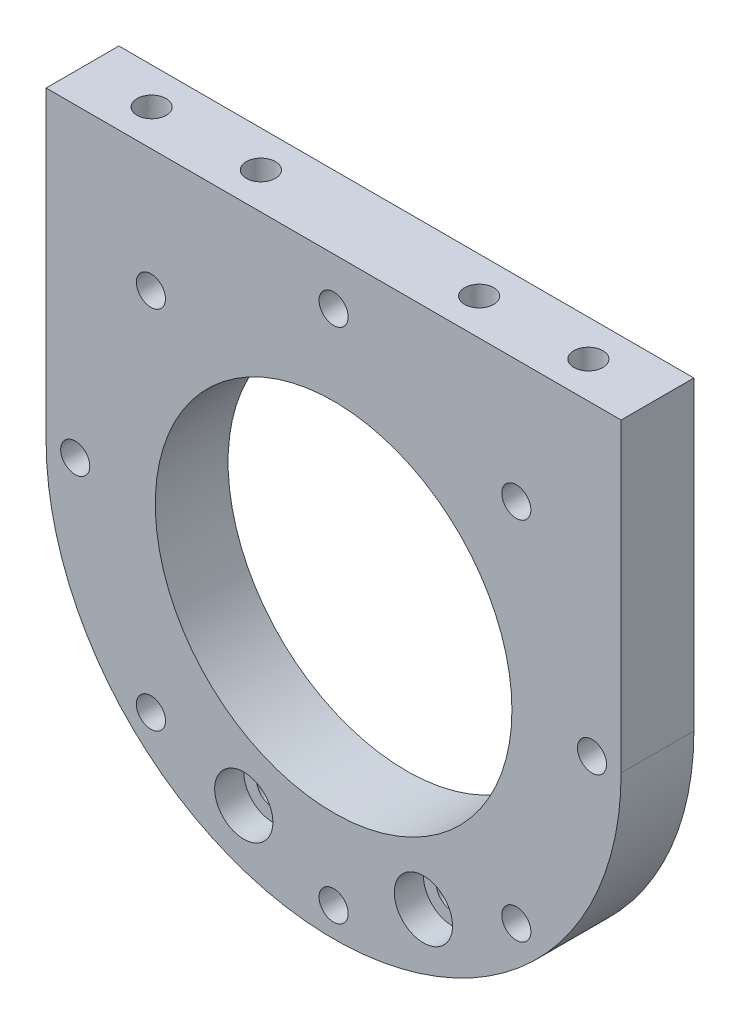
ISO-10303-21;
HEADER;
FILE_DESCRIPTION(('STEP AP214'),'2;1');
FILE_NAME('part.step','',(''),(''),'','','');
FILE_SCHEMA(('AUTOMOTIVE_DESIGN { 1 0 10303 214 1 1 1 1 }'));
ENDSEC;
DATA;
#1=APPLICATION_CONTEXT('core data for automotive mechanical design processes');
#2=APPLICATION_PROTOCOL_DEFINITION('international standard','automotive_design',2000,#1);
#3=PRODUCT_CONTEXT('',#1,'mechanical');
#4=PRODUCT('Part','Part','',(#3));
#5=PRODUCT_RELATED_PRODUCT_CATEGORY('part','',(#4));
#6=PRODUCT_DEFINITION_FORMATION('','',#4);
#7=PRODUCT_DEFINITION_CONTEXT('part definition',#1,'design');
#8=PRODUCT_DEFINITION('design','',#6,#7);
#9=PRODUCT_DEFINITION_SHAPE('','',#8);
#10=(LENGTH_UNIT() NAMED_UNIT(*) SI_UNIT(.MILLI.,.METRE.));
#11=(NAMED_UNIT(*) PLANE_ANGLE_UNIT() SI_UNIT($,.RADIAN.));
#12=(NAMED_UNIT(*) SI_UNIT($,.STERADIAN.) SOLID_ANGLE_UNIT());
#13=UNCERTAINTY_MEASURE_WITH_UNIT(LENGTH_MEASURE(1.E-05),#10,'distance_accuracy_value','');
#14=(GEOMETRIC_REPRESENTATION_CONTEXT(3) GLOBAL_UNCERTAINTY_ASSIGNED_CONTEXT((#13)) GLOBAL_UNIT_ASSIGNED_CONTEXT((#10,
#11,#12)) REPRESENTATION_CONTEXT('',''));
#15=CARTESIAN_POINT('',(0.,0.,0.));
#16=DIRECTION('',(0.,0.,1.));
#17=DIRECTION('',(1.,0.,0.));
#18=AXIS2_PLACEMENT_3D('',#15,#16,#17);
#19=CARTESIAN_POINT('',(12.3415406937742,-29.795114923489,10.));
#20=DIRECTION('',(0.,0.,-1.));
#21=DIRECTION('',(-1.,0.,0.));
#22=AXIS2_PLACEMENT_3D('',#19,#20,#21);
#23=CYLINDRICAL_SURFACE('',#22,2.25);
#24=CARTESIAN_POINT('',(12.3415406937742,-29.795114923489,0.));
#25=DIRECTION('',(0.,0.,1.));
#26=DIRECTION('',(1.,0.,0.));
#27=AXIS2_PLACEMENT_3D('',#24,#25,#26);
#28=CIRCLE('',#27,2.25);
#29=CARTESIAN_POINT('',(14.5915406937742,-29.795114923489,0.));
#30=VERTEX_POINT('',#29);
#31=EDGE_CURVE('E148',#30,#30,#28,.T.);
#32=ORIENTED_EDGE('',*,*,#31,.F.);
#33=EDGE_LOOP('',(#32));
#34=FACE_BOUND('',#33,.T.);
#35=CARTESIAN_POINT('',(12.3415406937742,-29.795114923489,6.));
#36=DIRECTION('',(0.,0.,1.));
#37=DIRECTION('',(1.,0.,0.));
#38=AXIS2_PLACEMENT_3D('',#35,#36,#37);
#39=CIRCLE('',#38,2.25);
#40=CARTESIAN_POINT('',(14.5915406937742,-29.795114923489,6.));
#41=VERTEX_POINT('',#40);
#42=EDGE_CURVE('E38',#41,#41,#39,.T.);
#43=ORIENTED_EDGE('',*,*,#42,.T.);
#44=EDGE_LOOP('',(#43));
#45=FACE_BOUND('',#44,.T.);
#46=ADVANCED_FACE('F34',(#34,#45),#23,.F.);
#47=CARTESIAN_POINT('',(-12.3415406937742,-29.795114923489,10.));
#48=DIRECTION('',(0.,0.,-1.));
#49=DIRECTION('',(-1.,0.,0.));
#50=AXIS2_PLACEMENT_3D('',#47,#48,#49);
#51=CYLINDRICAL_SURFACE('',#50,2.25);
#52=CARTESIAN_POINT('',(-12.3415406937742,-29.795114923489,0.));
#53=DIRECTION('',(0.,0.,1.));
#54=DIRECTION('',(1.,0.,0.));
#55=AXIS2_PLACEMENT_3D('',#52,#53,#54);
#56=CIRCLE('',#55,2.25);
#57=CARTESIAN_POINT('',(-10.0915406937742,-29.795114923489,0.));
#58=VERTEX_POINT('',#57);
#59=EDGE_CURVE('E193',#58,#58,#56,.T.);
#60=ORIENTED_EDGE('',*,*,#59,.F.);
#61=EDGE_LOOP('',(#60));
#62=FACE_BOUND('',#61,.T.);
#63=CARTESIAN_POINT('',(-12.3415406937742,-29.795114923489,6.));
#64=DIRECTION('',(0.,0.,1.));
#65=DIRECTION('',(1.,0.,0.));
#66=AXIS2_PLACEMENT_3D('',#63,#64,#65);
#67=CIRCLE('',#66,2.25);
#68=CARTESIAN_POINT('',(-10.0915406937742,-29.795114923489,6.));
#69=VERTEX_POINT('',#68);
#70=EDGE_CURVE('E110',#69,#69,#67,.T.);
#71=ORIENTED_EDGE('',*,*,#70,.T.);
#72=EDGE_LOOP('',(#71));
#73=FACE_BOUND('',#72,.T.);
#74=ADVANCED_FACE('F229',(#62,#73),#51,.F.);
#75=CARTESIAN_POINT('',(0.,0.,10.));
#76=DIRECTION('',(0.,0.,1.));
#77=DIRECTION('',(1.,0.,0.));
#78=AXIS2_PLACEMENT_3D('',#75,#76,#77);
#79=PLANE('',#78);
#80=CARTESIAN_POINT('',(12.3415406937742,-29.795114923489,10.));
#81=DIRECTION('',(0.,0.,1.));
#82=DIRECTION('',(1.,0.,0.));
#83=AXIS2_PLACEMENT_3D('',#80,#81,#82);
#84=CIRCLE('',#83,4.);
#85=CARTESIAN_POINT('',(16.3415406937742,-29.795114923489,10.));
#86=VERTEX_POINT('',#85);
#87=EDGE_CURVE('E127',#86,#86,#84,.T.);
#88=ORIENTED_EDGE('',*,*,#87,.F.);
#89=EDGE_LOOP('',(#88));
#90=FACE_BOUND('',#89,.T.);
#91=CARTESIAN_POINT('',(-12.3415406937742,-29.795114923489,10.));
#92=DIRECTION('',(0.,0.,1.));
#93=DIRECTION('',(1.,0.,0.));
#94=AXIS2_PLACEMENT_3D('',#91,#92,#93);
#95=CIRCLE('',#94,4.);
#96=CARTESIAN_POINT('',(-8.34154069377417,-29.795114923489,10.));
#97=VERTEX_POINT('',#96);
#98=EDGE_CURVE('E120',#97,#97,#95,.T.);
#99=ORIENTED_EDGE('',*,*,#98,.F.);
#100=EDGE_LOOP('',(#99));
#101=FACE_BOUND('',#100,.T.);
#102=CARTESIAN_POINT('',(25.1022907321221,-25.1022907321227,10.));
#103=DIRECTION('',(0.,0.,1.));
#104=DIRECTION('',(1.,0.,0.));
#105=AXIS2_PLACEMENT_3D('',#102,#103,#104);
#106=CIRCLE('',#105,2.);
#107=CARTESIAN_POINT('',(27.1022907321221,-25.1022907321227,10.));
#108=VERTEX_POINT('',#107);
#109=EDGE_CURVE('E154',#108,#108,#106,.T.);
#110=ORIENTED_EDGE('',*,*,#109,.F.);
#111=EDGE_LOOP('',(#110));
#112=FACE_BOUND('',#111,.T.);
#113=CARTESIAN_POINT('',(25.1022907321227,25.1022907321222,10.));
#114=DIRECTION('',(0.,0.,1.));
#115=DIRECTION('',(1.,0.,0.));
#116=AXIS2_PLACEMENT_3D('',#113,#114,#115);
#117=CIRCLE('',#116,2.);
#118=CARTESIAN_POINT('',(27.1022907321227,25.1022907321222,10.));
#119=VERTEX_POINT('',#118);
#120=EDGE_CURVE('E166',#119,#119,#117,.T.);
#121=ORIENTED_EDGE('',*,*,#120,.F.);
#122=EDGE_LOOP('',(#121));
#123=FACE_BOUND('',#122,.T.);
#124=CARTESIAN_POINT('',(-25.1022907321223,25.1022907321226,10.));
#125=DIRECTION('',(0.,0.,1.));
#126=DIRECTION('',(1.,0.,0.));
#127=AXIS2_PLACEMENT_3D('',#124,#125,#126);
#128=CIRCLE('',#127,2.);
#129=CARTESIAN_POINT('',(-23.1022907321223,25.1022907321226,10.));
#130=VERTEX_POINT('',#129);
#131=EDGE_CURVE('E178',#130,#130,#128,.T.);
#132=ORIENTED_EDGE('',*,*,#131,.F.);
#133=EDGE_LOOP('',(#132));
#134=FACE_BOUND('',#133,.T.);
#135=CARTESIAN_POINT('',(-25.1022907321225,-25.1022907321224,10.));
#136=DIRECTION('',(0.,0.,1.));
#137=DIRECTION('',(1.,0.,0.));
#138=AXIS2_PLACEMENT_3D('',#135,#136,#137);
#139=CIRCLE('',#138,2.);
#140=CARTESIAN_POINT('',(-23.1022907321225,-25.1022907321224,10.));
#141=VERTEX_POINT('',#140);
#142=EDGE_CURVE('E190',#141,#141,#139,.T.);
#143=ORIENTED_EDGE('',*,*,#142,.F.);
#144=EDGE_LOOP('',(#143));
#145=FACE_BOUND('',#144,.T.);
#146=CARTESIAN_POINT('',(0.,0.,10.));
#147=DIRECTION('',(0.,0.,1.));
#148=DIRECTION('',(1.,0.,0.));
#149=AXIS2_PLACEMENT_3D('',#146,#147,#148);
#150=CIRCLE('',#149,24.5);
#151=CARTESIAN_POINT('',(24.5,0.,10.));
#152=VERTEX_POINT('',#151);
#153=EDGE_CURVE('E199',#152,#152,#150,.T.);
#154=ORIENTED_EDGE('',*,*,#153,.F.);
#155=EDGE_LOOP('',(#154));
#156=FACE_BOUND('',#155,.T.);
#157=CARTESIAN_POINT('',(0.,0.,10.));
#158=DIRECTION('',(0.,0.,1.));
#159=DIRECTION('',(1.,0.,0.));
#160=AXIS2_PLACEMENT_3D('',#157,#158,#159);
#161=CIRCLE('',#160,39.5);
#162=CARTESIAN_POINT('',(-39.5,0.,10.));
#163=VERTEX_POINT('',#162);
#164=CARTESIAN_POINT('',(39.5,0.,10.));
#165=VERTEX_POINT('',#164);
#166=EDGE_CURVE('E89',#163,#165,#161,.T.);
#167=ORIENTED_EDGE('',*,*,#166,.T.);
#168=DIRECTION('',(0.,1.,0.));
#169=VECTOR('',#168,1.);
#170=CARTESIAN_POINT('',(39.5,42.,10.));
#171=LINE('',#170,#169);
#172=CARTESIAN_POINT('',(39.5,42.,10.));
#173=VERTEX_POINT('',#172);
#174=EDGE_CURVE('E83',#165,#173,#171,.T.);
#175=ORIENTED_EDGE('',*,*,#174,.T.);
#176=DIRECTION('',(-1.,0.,0.));
#177=VECTOR('',#176,1.);
#178=CARTESIAN_POINT('',(-39.5,42.,10.));
#179=LINE('',#178,#177);
#180=CARTESIAN_POINT('',(-39.5,42.,10.));
#181=VERTEX_POINT('',#180);
#182=EDGE_CURVE('E87',#173,#181,#179,.T.);
#183=ORIENTED_EDGE('',*,*,#182,.T.);
#184=DIRECTION('',(0.,-1.,0.));
#185=VECTOR('',#184,1.);
#186=CARTESIAN_POINT('',(-39.5,0.,10.));
#187=LINE('',#186,#185);
#188=EDGE_CURVE('E53',#181,#163,#187,.T.);
#189=ORIENTED_EDGE('',*,*,#188,.T.);
#190=EDGE_LOOP('',(#167,#175,#183,#189));
#191=FACE_BOUND('',#190,.T.);
#192=CARTESIAN_POINT('',(0.,-35.5,10.));
#193=DIRECTION('',(0.,0.,1.));
#194=DIRECTION('',(1.,0.,0.));
#195=AXIS2_PLACEMENT_3D('',#192,#193,#194);
#196=CIRCLE('',#195,2.);
#197=CARTESIAN_POINT('',(2.,-35.5,10.));
#198=VERTEX_POINT('',#197);
#199=EDGE_CURVE('E105',#198,#198,#196,.T.);
#200=ORIENTED_EDGE('',*,*,#199,.F.);
#201=EDGE_LOOP('',(#200));
#202=FACE_BOUND('',#201,.T.);
#203=CARTESIAN_POINT('',(-35.5,1.23947587528931E-13,10.));
#204=DIRECTION('',(0.,0.,1.));
#205=DIRECTION('',(1.,0.,0.));
#206=AXIS2_PLACEMENT_3D('',#203,#204,#205);
#207=CIRCLE('',#206,2.);
#208=CARTESIAN_POINT('',(-33.5,1.23947587528931E-13,10.));
#209=VERTEX_POINT('',#208);
#210=EDGE_CURVE('E184',#209,#209,#207,.T.);
#211=ORIENTED_EDGE('',*,*,#210,.F.);
#212=EDGE_LOOP('',(#211));
#213=FACE_BOUND('',#212,.T.);
#214=CARTESIAN_POINT('',(2.47895175057862E-13,35.5,10.));
#215=DIRECTION('',(0.,0.,1.));
#216=DIRECTION('',(1.,0.,0.));
#217=AXIS2_PLACEMENT_3D('',#214,#215,#216);
#218=CIRCLE('',#217,2.);
#219=CARTESIAN_POINT('',(2.00000000000025,35.5,10.));
#220=VERTEX_POINT('',#219);
#221=EDGE_CURVE('E172',#220,#220,#218,.T.);
#222=ORIENTED_EDGE('',*,*,#221,.F.);
#223=EDGE_LOOP('',(#222));
#224=FACE_BOUND('',#223,.T.);
#225=CARTESIAN_POINT('',(35.5,-3.71842762586794E-13,10.));
#226=DIRECTION('',(0.,0.,1.));
#227=DIRECTION('',(1.,0.,0.));
#228=AXIS2_PLACEMENT_3D('',#225,#226,#227);
#229=CIRCLE('',#228,2.);
#230=CARTESIAN_POINT('',(37.5,-3.71842762586794E-13,10.));
#231=VERTEX_POINT('',#230);
#232=EDGE_CURVE('E160',#231,#231,#229,.T.);
#233=ORIENTED_EDGE('',*,*,#232,.F.);
#234=EDGE_LOOP('',(#233));
#235=FACE_BOUND('',#234,.T.);
#236=ADVANCED_FACE('F84',(#90,#101,#112,#123,#134,#145,#156,#191,#202,#213,#224,#235),#79,.T.);
#237=CARTESIAN_POINT('',(0.,0.,0.));
#238=DIRECTION('',(0.,0.,1.));
#239=DIRECTION('',(1.,0.,0.));
#240=AXIS2_PLACEMENT_3D('',#237,#238,#239);
#241=PLANE('',#240);
#242=CARTESIAN_POINT('',(0.,0.,0.));
#243=DIRECTION('',(0.,0.,1.));
#244=DIRECTION('',(1.,0.,0.));
#245=AXIS2_PLACEMENT_3D('',#242,#243,#244);
#246=CIRCLE('',#245,39.5);
#247=CARTESIAN_POINT('',(-39.5,0.,0.));
#248=VERTEX_POINT('',#247);
#249=CARTESIAN_POINT('',(39.5,0.,0.));
#250=VERTEX_POINT('',#249);
#251=EDGE_CURVE('E102',#248,#250,#246,.T.);
#252=ORIENTED_EDGE('',*,*,#251,.F.);
#253=DIRECTION('',(0.,-1.,0.));
#254=VECTOR('',#253,1.);
#255=CARTESIAN_POINT('',(-39.5,0.,0.));
#256=LINE('',#255,#254);
#257=CARTESIAN_POINT('',(-39.5,42.,0.));
#258=VERTEX_POINT('',#257);
#259=EDGE_CURVE('E76',#258,#248,#256,.T.);
#260=ORIENTED_EDGE('',*,*,#259,.F.);
#261=DIRECTION('',(-1.,0.,0.));
#262=VECTOR('',#261,1.);
#263=CARTESIAN_POINT('',(-39.5,42.,0.));
#264=LINE('',#263,#262);
#265=CARTESIAN_POINT('',(39.5,42.,0.));
#266=VERTEX_POINT('',#265);
#267=EDGE_CURVE('E70',#266,#258,#264,.T.);
#268=ORIENTED_EDGE('',*,*,#267,.F.);
#269=DIRECTION('',(0.,1.,0.));
#270=VECTOR('',#269,1.);
#271=CARTESIAN_POINT('',(39.5,42.,0.));
#272=LINE('',#271,#270);
#273=EDGE_CURVE('E93',#250,#266,#272,.T.);
#274=ORIENTED_EDGE('',*,*,#273,.F.);
#275=EDGE_LOOP('',(#252,#260,#268,#274));
#276=FACE_BOUND('',#275,.T.);
#277=CARTESIAN_POINT('',(0.,-35.5,0.));
#278=DIRECTION('',(0.,0.,1.));
#279=DIRECTION('',(1.,0.,0.));
#280=AXIS2_PLACEMENT_3D('',#277,#278,#279);
#281=CIRCLE('',#280,2.);
#282=CARTESIAN_POINT('',(2.,-35.5,0.));
#283=VERTEX_POINT('',#282);
#284=EDGE_CURVE('E202',#283,#283,#281,.T.);
#285=ORIENTED_EDGE('',*,*,#284,.T.);
#286=EDGE_LOOP('',(#285));
#287=FACE_BOUND('',#286,.T.);
#288=CARTESIAN_POINT('',(0.,0.,0.));
#289=DIRECTION('',(0.,0.,1.));
#290=DIRECTION('',(1.,0.,0.));
#291=AXIS2_PLACEMENT_3D('',#288,#289,#290);
#292=CIRCLE('',#291,24.5);
#293=CARTESIAN_POINT('',(24.5,0.,0.));
#294=VERTEX_POINT('',#293);
#295=EDGE_CURVE('E198',#294,#294,#292,.T.);
#296=ORIENTED_EDGE('',*,*,#295,.T.);
#297=EDGE_LOOP('',(#296));
#298=FACE_BOUND('',#297,.T.);
#299=ORIENTED_EDGE('',*,*,#59,.T.);
#300=EDGE_LOOP('',(#299));
#301=FACE_BOUND('',#300,.T.);
#302=CARTESIAN_POINT('',(-25.1022907321225,-25.1022907321224,0.));
#303=DIRECTION('',(0.,0.,1.));
#304=DIRECTION('',(1.,0.,0.));
#305=AXIS2_PLACEMENT_3D('',#302,#303,#304);
#306=CIRCLE('',#305,2.);
#307=CARTESIAN_POINT('',(-23.1022907321225,-25.1022907321224,0.));
#308=VERTEX_POINT('',#307);
#309=EDGE_CURVE('E187',#308,#308,#306,.T.);
#310=ORIENTED_EDGE('',*,*,#309,.T.);
#311=EDGE_LOOP('',(#310));
#312=FACE_BOUND('',#311,.T.);
#313=CARTESIAN_POINT('',(-35.5,1.23947587528931E-13,0.));
#314=DIRECTION('',(0.,0.,1.));
#315=DIRECTION('',(1.,0.,0.));
#316=AXIS2_PLACEMENT_3D('',#313,#314,#315);
#317=CIRCLE('',#316,2.);
#318=CARTESIAN_POINT('',(-33.5,1.23947587528931E-13,0.));
#319=VERTEX_POINT('',#318);
#320=EDGE_CURVE('E181',#319,#319,#317,.T.);
#321=ORIENTED_EDGE('',*,*,#320,.T.);
#322=EDGE_LOOP('',(#321));
#323=FACE_BOUND('',#322,.T.);
#324=CARTESIAN_POINT('',(-25.1022907321223,25.1022907321226,0.));
#325=DIRECTION('',(0.,0.,1.));
#326=DIRECTION('',(1.,0.,0.));
#327=AXIS2_PLACEMENT_3D('',#324,#325,#326);
#328=CIRCLE('',#327,2.);
#329=CARTESIAN_POINT('',(-23.1022907321223,25.1022907321226,0.));
#330=VERTEX_POINT('',#329);
#331=EDGE_CURVE('E175',#330,#330,#328,.T.);
#332=ORIENTED_EDGE('',*,*,#331,.T.);
#333=EDGE_LOOP('',(#332));
#334=FACE_BOUND('',#333,.T.);
#335=CARTESIAN_POINT('',(2.47895175057862E-13,35.5,0.));
#336=DIRECTION('',(0.,0.,1.));
#337=DIRECTION('',(1.,0.,0.));
#338=AXIS2_PLACEMENT_3D('',#335,#336,#337);
#339=CIRCLE('',#338,2.);
#340=CARTESIAN_POINT('',(2.00000000000025,35.5,0.));
#341=VERTEX_POINT('',#340);
#342=EDGE_CURVE('E169',#341,#341,#339,.T.);
#343=ORIENTED_EDGE('',*,*,#342,.T.);
#344=EDGE_LOOP('',(#343));
#345=FACE_BOUND('',#344,.T.);
#346=CARTESIAN_POINT('',(25.1022907321227,25.1022907321222,0.));
#347=DIRECTION('',(0.,0.,1.));
#348=DIRECTION('',(1.,0.,0.));
#349=AXIS2_PLACEMENT_3D('',#346,#347,#348);
#350=CIRCLE('',#349,2.);
#351=CARTESIAN_POINT('',(27.1022907321227,25.1022907321222,0.));
#352=VERTEX_POINT('',#351);
#353=EDGE_CURVE('E163',#352,#352,#350,.T.);
#354=ORIENTED_EDGE('',*,*,#353,.T.);
#355=EDGE_LOOP('',(#354));
#356=FACE_BOUND('',#355,.T.);
#357=CARTESIAN_POINT('',(35.5,-3.71842762586794E-13,0.));
#358=DIRECTION('',(0.,0.,1.));
#359=DIRECTION('',(1.,0.,0.));
#360=AXIS2_PLACEMENT_3D('',#357,#358,#359);
#361=CIRCLE('',#360,2.);
#362=CARTESIAN_POINT('',(37.5,-3.71842762586794E-13,0.));
#363=VERTEX_POINT('',#362);
#364=EDGE_CURVE('E157',#363,#363,#361,.T.);
#365=ORIENTED_EDGE('',*,*,#364,.T.);
#366=EDGE_LOOP('',(#365));
#367=FACE_BOUND('',#366,.T.);
#368=CARTESIAN_POINT('',(25.1022907321221,-25.1022907321227,0.));
#369=DIRECTION('',(0.,0.,1.));
#370=DIRECTION('',(1.,0.,0.));
#371=AXIS2_PLACEMENT_3D('',#368,#369,#370);
#372=CIRCLE('',#371,2.);
#373=CARTESIAN_POINT('',(27.1022907321221,-25.1022907321227,0.));
#374=VERTEX_POINT('',#373);
#375=EDGE_CURVE('E153',#374,#374,#372,.T.);
#376=ORIENTED_EDGE('',*,*,#375,.T.);
#377=EDGE_LOOP('',(#376));
#378=FACE_BOUND('',#377,.T.);
#379=ORIENTED_EDGE('',*,*,#31,.T.);
#380=EDGE_LOOP('',(#379));
#381=FACE_BOUND('',#380,.T.);
#382=ADVANCED_FACE('F210',(#276,#287,#298,#301,#312,#323,#334,#345,#356,#367,#378,#381),#241,.F.);
#383=CARTESIAN_POINT('',(0.,0.,10.));
#384=DIRECTION('',(0.,0.,-1.));
#385=DIRECTION('',(-1.,0.,0.));
#386=AXIS2_PLACEMENT_3D('',#383,#384,#385);
#387=CYLINDRICAL_SURFACE('',#386,39.5);
#388=ORIENTED_EDGE('',*,*,#251,.T.);
#389=DIRECTION('',(0.,0.,-1.));
#390=VECTOR('',#389,1.);
#391=CARTESIAN_POINT('',(39.5,0.,10.));
#392=LINE('',#391,#390);
#393=EDGE_CURVE('E11',#165,#250,#392,.T.);
#394=ORIENTED_EDGE('',*,*,#393,.F.);
#395=ORIENTED_EDGE('',*,*,#166,.F.);
#396=DIRECTION('',(0.,0.,-1.));
#397=VECTOR('',#396,1.);
#398=CARTESIAN_POINT('',(-39.5,0.,10.));
#399=LINE('',#398,#397);
#400=EDGE_CURVE('E98',#163,#248,#399,.T.);
#401=ORIENTED_EDGE('',*,*,#400,.T.);
#402=EDGE_LOOP('',(#388,#394,#395,#401));
#403=FACE_BOUND('',#402,.T.);
#404=ADVANCED_FACE('F36',(#403),#387,.T.);
#405=CARTESIAN_POINT('',(39.5,42.,10.));
#406=DIRECTION('',(-1.,0.,0.));
#407=DIRECTION('',(0.,0.,1.));
#408=AXIS2_PLACEMENT_3D('',#405,#406,#407);
#409=PLANE('',#408);
#410=ORIENTED_EDGE('',*,*,#273,.T.);
#411=DIRECTION('',(0.,0.,-1.));
#412=VECTOR('',#411,1.);
#413=CARTESIAN_POINT('',(39.5,42.,10.));
#414=LINE('',#413,#412);
#415=EDGE_CURVE('E44',#173,#266,#414,.T.);
#416=ORIENTED_EDGE('',*,*,#415,.F.);
#417=ORIENTED_EDGE('',*,*,#174,.F.);
#418=ORIENTED_EDGE('',*,*,#393,.T.);
#419=EDGE_LOOP('',(#410,#416,#417,#418));
#420=FACE_BOUND('',#419,.T.);
#421=ADVANCED_FACE('F92',(#420),#409,.F.);
#422=CARTESIAN_POINT('',(-39.5,42.,10.));
#423=DIRECTION('',(0.,-1.,0.));
#424=DIRECTION('',(0.,0.,-1.));
#425=AXIS2_PLACEMENT_3D('',#422,#423,#424);
#426=PLANE('',#425);
#427=CARTESIAN_POINT('',(30.,42.,5.));
#428=DIRECTION('',(0.,1.,0.));
#429=DIRECTION('',(0.,0.,1.));
#430=AXIS2_PLACEMENT_3D('',#427,#428,#429);
#431=CIRCLE('',#430,2.);
#432=CARTESIAN_POINT('',(30.,42.,7.));
#433=VERTEX_POINT('',#432);
#434=EDGE_CURVE('E112',#433,#433,#431,.T.);
#435=ORIENTED_EDGE('',*,*,#434,.F.);
#436=EDGE_LOOP('',(#435));
#437=FACE_BOUND('',#436,.T.);
#438=CARTESIAN_POINT('',(15.,42.,5.));
#439=DIRECTION('',(0.,1.,0.));
#440=DIRECTION('',(0.,0.,1.));
#441=AXIS2_PLACEMENT_3D('',#438,#439,#440);
#442=CIRCLE('',#441,2.);
#443=CARTESIAN_POINT('',(15.,42.,7.));
#444=VERTEX_POINT('',#443);
#445=EDGE_CURVE('E131',#444,#444,#442,.T.);
#446=ORIENTED_EDGE('',*,*,#445,.F.);
#447=EDGE_LOOP('',(#446));
#448=FACE_BOUND('',#447,.T.);
#449=CARTESIAN_POINT('',(-15.,42.,5.));
#450=DIRECTION('',(0.,1.,0.));
#451=DIRECTION('',(0.,0.,1.));
#452=AXIS2_PLACEMENT_3D('',#449,#450,#451);
#453=CIRCLE('',#452,2.);
#454=CARTESIAN_POINT('',(-15.,42.,7.));
#455=VERTEX_POINT('',#454);
#456=EDGE_CURVE('E136',#455,#455,#453,.T.);
#457=ORIENTED_EDGE('',*,*,#456,.F.);
#458=EDGE_LOOP('',(#457));
#459=FACE_BOUND('',#458,.T.);
#460=CARTESIAN_POINT('',(-30.,42.,5.));
#461=DIRECTION('',(0.,1.,0.));
#462=DIRECTION('',(0.,0.,1.));
#463=AXIS2_PLACEMENT_3D('',#460,#461,#462);
#464=CIRCLE('',#463,2.);
#465=CARTESIAN_POINT('',(-30.,42.,7.));
#466=VERTEX_POINT('',#465);
#467=EDGE_CURVE('E142',#466,#466,#464,.T.);
#468=ORIENTED_EDGE('',*,*,#467,.F.);
#469=EDGE_LOOP('',(#468));
#470=FACE_BOUND('',#469,.T.);
#471=ORIENTED_EDGE('',*,*,#267,.T.);
#472=DIRECTION('',(0.,0.,-1.));
#473=VECTOR('',#472,1.);
#474=CARTESIAN_POINT('',(-39.5,42.,10.));
#475=LINE('',#474,#473);
#476=EDGE_CURVE('E94',#181,#258,#475,.T.);
#477=ORIENTED_EDGE('',*,*,#476,.F.);
#478=ORIENTED_EDGE('',*,*,#182,.F.);
#479=ORIENTED_EDGE('',*,*,#415,.T.);
#480=EDGE_LOOP('',(#471,#477,#478,#479));
#481=FACE_BOUND('',#480,.T.);
#482=ADVANCED_FACE('F96',(#437,#448,#459,#470,#481),#426,.F.);
#483=CARTESIAN_POINT('',(-39.5,0.,10.));
#484=DIRECTION('',(1.,0.,0.));
#485=DIRECTION('',(0.,0.,-1.));
#486=AXIS2_PLACEMENT_3D('',#483,#484,#485);
#487=PLANE('',#486);
#488=ORIENTED_EDGE('',*,*,#259,.T.);
#489=ORIENTED_EDGE('',*,*,#400,.F.);
#490=ORIENTED_EDGE('',*,*,#188,.F.);
#491=ORIENTED_EDGE('',*,*,#476,.T.);
#492=EDGE_LOOP('',(#488,#489,#490,#491));
#493=FACE_BOUND('',#492,.T.);
#494=ADVANCED_FACE('F216',(#493),#487,.F.);
#495=CARTESIAN_POINT('',(0.,-35.5,10.));
#496=DIRECTION('',(0.,0.,-1.));
#497=DIRECTION('',(-1.,0.,0.));
#498=AXIS2_PLACEMENT_3D('',#495,#496,#497);
#499=CYLINDRICAL_SURFACE('',#498,2.);
#500=ORIENTED_EDGE('',*,*,#199,.T.);
#501=EDGE_LOOP('',(#500));
#502=FACE_BOUND('',#501,.T.);
#503=ORIENTED_EDGE('',*,*,#284,.F.);
#504=EDGE_LOOP('',(#503));
#505=FACE_BOUND('',#504,.T.);
#506=ADVANCED_FACE('F213',(#502,#505),#499,.F.);
#507=CARTESIAN_POINT('',(0.,0.,10.));
#508=DIRECTION('',(0.,0.,-1.));
#509=DIRECTION('',(-1.,0.,0.));
#510=AXIS2_PLACEMENT_3D('',#507,#508,#509);
#511=CYLINDRICAL_SURFACE('',#510,24.5);
#512=ORIENTED_EDGE('',*,*,#153,.T.);
#513=EDGE_LOOP('',(#512));
#514=FACE_BOUND('',#513,.T.);
#515=ORIENTED_EDGE('',*,*,#295,.F.);
#516=EDGE_LOOP('',(#515));
#517=FACE_BOUND('',#516,.T.);
#518=ADVANCED_FACE('F215',(#514,#517),#511,.F.);
#519=CARTESIAN_POINT('',(-25.1022907321225,-25.1022907321224,10.));
#520=DIRECTION('',(0.,0.,-1.));
#521=DIRECTION('',(-1.,0.,0.));
#522=AXIS2_PLACEMENT_3D('',#519,#520,#521);
#523=CYLINDRICAL_SURFACE('',#522,2.);
#524=ORIENTED_EDGE('',*,*,#142,.T.);
#525=EDGE_LOOP('',(#524));
#526=FACE_BOUND('',#525,.T.);
#527=ORIENTED_EDGE('',*,*,#309,.F.);
#528=EDGE_LOOP('',(#527));
#529=FACE_BOUND('',#528,.T.);
#530=ADVANCED_FACE('F223',(#526,#529),#523,.F.);
#531=CARTESIAN_POINT('',(-35.5,1.23947587528931E-13,10.));
#532=DIRECTION('',(0.,0.,-1.));
#533=DIRECTION('',(-1.,0.,0.));
#534=AXIS2_PLACEMENT_3D('',#531,#532,#533);
#535=CYLINDRICAL_SURFACE('',#534,2.);
#536=ORIENTED_EDGE('',*,*,#210,.T.);
#537=EDGE_LOOP('',(#536));
#538=FACE_BOUND('',#537,.T.);
#539=ORIENTED_EDGE('',*,*,#320,.F.);
#540=EDGE_LOOP('',(#539));
#541=FACE_BOUND('',#540,.T.);
#542=ADVANCED_FACE('F262',(#538,#541),#535,.F.);
#543=CARTESIAN_POINT('',(-25.1022907321223,25.1022907321226,10.));
#544=DIRECTION('',(0.,0.,-1.));
#545=DIRECTION('',(-1.,0.,0.));
#546=AXIS2_PLACEMENT_3D('',#543,#544,#545);
#547=CYLINDRICAL_SURFACE('',#546,2.);
#548=ORIENTED_EDGE('',*,*,#131,.T.);
#549=EDGE_LOOP('',(#548));
#550=FACE_BOUND('',#549,.T.);
#551=ORIENTED_EDGE('',*,*,#331,.F.);
#552=EDGE_LOOP('',(#551));
#553=FACE_BOUND('',#552,.T.);
#554=ADVANCED_FACE('F258',(#550,#553),#547,.F.);
#555=CARTESIAN_POINT('',(2.47895175057862E-13,35.5,10.));
#556=DIRECTION('',(0.,0.,-1.));
#557=DIRECTION('',(-1.,0.,0.));
#558=AXIS2_PLACEMENT_3D('',#555,#556,#557);
#559=CYLINDRICAL_SURFACE('',#558,2.);
#560=ORIENTED_EDGE('',*,*,#221,.T.);
#561=EDGE_LOOP('',(#560));
#562=FACE_BOUND('',#561,.T.);
#563=ORIENTED_EDGE('',*,*,#342,.F.);
#564=EDGE_LOOP('',(#563));
#565=FACE_BOUND('',#564,.T.);
#566=ADVANCED_FACE('F254',(#562,#565),#559,.F.);
#567=CARTESIAN_POINT('',(25.1022907321227,25.1022907321222,10.));
#568=DIRECTION('',(0.,0.,-1.));
#569=DIRECTION('',(-1.,0.,0.));
#570=AXIS2_PLACEMENT_3D('',#567,#568,#569);
#571=CYLINDRICAL_SURFACE('',#570,2.);
#572=ORIENTED_EDGE('',*,*,#120,.T.);
#573=EDGE_LOOP('',(#572));
#574=FACE_BOUND('',#573,.T.);
#575=ORIENTED_EDGE('',*,*,#353,.F.);
#576=EDGE_LOOP('',(#575));
#577=FACE_BOUND('',#576,.T.);
#578=ADVANCED_FACE('F250',(#574,#577),#571,.F.);
#579=CARTESIAN_POINT('',(35.5,-3.71842762586794E-13,10.));
#580=DIRECTION('',(0.,0.,-1.));
#581=DIRECTION('',(-1.,0.,0.));
#582=AXIS2_PLACEMENT_3D('',#579,#580,#581);
#583=CYLINDRICAL_SURFACE('',#582,2.);
#584=ORIENTED_EDGE('',*,*,#232,.T.);
#585=EDGE_LOOP('',(#584));
#586=FACE_BOUND('',#585,.T.);
#587=ORIENTED_EDGE('',*,*,#364,.F.);
#588=EDGE_LOOP('',(#587));
#589=FACE_BOUND('',#588,.T.);
#590=ADVANCED_FACE('F246',(#586,#589),#583,.F.);
#591=CARTESIAN_POINT('',(25.1022907321221,-25.1022907321227,10.));
#592=DIRECTION('',(0.,0.,-1.));
#593=DIRECTION('',(-1.,0.,0.));
#594=AXIS2_PLACEMENT_3D('',#591,#592,#593);
#595=CYLINDRICAL_SURFACE('',#594,2.);
#596=ORIENTED_EDGE('',*,*,#109,.T.);
#597=EDGE_LOOP('',(#596));
#598=FACE_BOUND('',#597,.T.);
#599=ORIENTED_EDGE('',*,*,#375,.F.);
#600=EDGE_LOOP('',(#599));
#601=FACE_BOUND('',#600,.T.);
#602=ADVANCED_FACE('F243',(#598,#601),#595,.F.);
#603=CARTESIAN_POINT('',(-30.,27.,5.));
#604=DIRECTION('',(0.,1.,0.));
#605=DIRECTION('',(0.,0.,1.));
#606=AXIS2_PLACEMENT_3D('',#603,#604,#605);
#607=CYLINDRICAL_SURFACE('',#606,2.);
#608=CARTESIAN_POINT('',(-30.,27.,5.));
#609=DIRECTION('',(0.,1.,0.));
#610=DIRECTION('',(0.,0.,1.));
#611=AXIS2_PLACEMENT_3D('',#608,#609,#610);
#612=CIRCLE('',#611,2.);
#613=CARTESIAN_POINT('',(-30.,27.,7.));
#614=VERTEX_POINT('',#613);
#615=EDGE_CURVE('E145',#614,#614,#612,.T.);
#616=ORIENTED_EDGE('',*,*,#615,.F.);
#617=EDGE_LOOP('',(#616));
#618=FACE_BOUND('',#617,.T.);
#619=ORIENTED_EDGE('',*,*,#467,.T.);
#620=EDGE_LOOP('',(#619));
#621=FACE_BOUND('',#620,.T.);
#622=ADVANCED_FACE('F241',(#618,#621),#607,.F.);
#623=CARTESIAN_POINT('',(-30.,27.,5.));
#624=DIRECTION('',(0.,1.,0.));
#625=DIRECTION('',(0.,0.,1.));
#626=AXIS2_PLACEMENT_3D('',#623,#624,#625);
#627=PLANE('',#626);
#628=ORIENTED_EDGE('',*,*,#615,.T.);
#629=EDGE_LOOP('',(#628));
#630=FACE_BOUND('',#629,.T.);
#631=ADVANCED_FACE('F379',(#630),#627,.T.);
#632=CARTESIAN_POINT('',(-15.,27.,5.));
#633=DIRECTION('',(0.,1.,0.));
#634=DIRECTION('',(0.,0.,1.));
#635=AXIS2_PLACEMENT_3D('',#632,#633,#634);
#636=CYLINDRICAL_SURFACE('',#635,2.);
#637=CARTESIAN_POINT('',(-15.,27.,5.));
#638=DIRECTION('',(0.,1.,0.));
#639=DIRECTION('',(0.,0.,1.));
#640=AXIS2_PLACEMENT_3D('',#637,#638,#639);
#641=CIRCLE('',#640,2.);
#642=CARTESIAN_POINT('',(-15.,27.,7.));
#643=VERTEX_POINT('',#642);
#644=EDGE_CURVE('E139',#643,#643,#641,.T.);
#645=ORIENTED_EDGE('',*,*,#644,.F.);
#646=EDGE_LOOP('',(#645));
#647=FACE_BOUND('',#646,.T.);
#648=ORIENTED_EDGE('',*,*,#456,.T.);
#649=EDGE_LOOP('',(#648));
#650=FACE_BOUND('',#649,.T.);
#651=ADVANCED_FACE('F385',(#647,#650),#636,.F.);
#652=CARTESIAN_POINT('',(-15.,27.,5.));
#653=DIRECTION('',(0.,1.,0.));
#654=DIRECTION('',(0.,0.,1.));
#655=AXIS2_PLACEMENT_3D('',#652,#653,#654);
#656=PLANE('',#655);
#657=ORIENTED_EDGE('',*,*,#644,.T.);
#658=EDGE_LOOP('',(#657));
#659=FACE_BOUND('',#658,.T.);
#660=ADVANCED_FACE('F392',(#659),#656,.T.);
#661=CARTESIAN_POINT('',(15.,27.,5.));
#662=DIRECTION('',(0.,1.,0.));
#663=DIRECTION('',(0.,0.,1.));
#664=AXIS2_PLACEMENT_3D('',#661,#662,#663);
#665=CYLINDRICAL_SURFACE('',#664,2.);
#666=CARTESIAN_POINT('',(15.,27.,5.));
#667=DIRECTION('',(0.,1.,0.));
#668=DIRECTION('',(0.,0.,1.));
#669=AXIS2_PLACEMENT_3D('',#666,#667,#668);
#670=CIRCLE('',#669,2.);
#671=CARTESIAN_POINT('',(15.,27.,7.));
#672=VERTEX_POINT('',#671);
#673=EDGE_CURVE('E133',#672,#672,#670,.T.);
#674=ORIENTED_EDGE('',*,*,#673,.F.);
#675=EDGE_LOOP('',(#674));
#676=FACE_BOUND('',#675,.T.);
#677=ORIENTED_EDGE('',*,*,#445,.T.);
#678=EDGE_LOOP('',(#677));
#679=FACE_BOUND('',#678,.T.);
#680=ADVANCED_FACE('F400',(#676,#679),#665,.F.);
#681=CARTESIAN_POINT('',(15.,27.,5.));
#682=DIRECTION('',(0.,1.,0.));
#683=DIRECTION('',(0.,0.,1.));
#684=AXIS2_PLACEMENT_3D('',#681,#682,#683);
#685=PLANE('',#684);
#686=ORIENTED_EDGE('',*,*,#673,.T.);
#687=EDGE_LOOP('',(#686));
#688=FACE_BOUND('',#687,.T.);
#689=ADVANCED_FACE('F408',(#688),#685,.T.);
#690=CARTESIAN_POINT('',(30.,27.,5.));
#691=DIRECTION('',(0.,1.,0.));
#692=DIRECTION('',(0.,0.,1.));
#693=AXIS2_PLACEMENT_3D('',#690,#691,#692);
#694=CYLINDRICAL_SURFACE('',#693,2.);
#695=CARTESIAN_POINT('',(30.,27.,5.));
#696=DIRECTION('',(0.,1.,0.));
#697=DIRECTION('',(0.,0.,1.));
#698=AXIS2_PLACEMENT_3D('',#695,#696,#697);
#699=CIRCLE('',#698,2.);
#700=CARTESIAN_POINT('',(30.,27.,7.));
#701=VERTEX_POINT('',#700);
#702=EDGE_CURVE('E117',#701,#701,#699,.T.);
#703=ORIENTED_EDGE('',*,*,#702,.F.);
#704=EDGE_LOOP('',(#703));
#705=FACE_BOUND('',#704,.T.);
#706=ORIENTED_EDGE('',*,*,#434,.T.);
#707=EDGE_LOOP('',(#706));
#708=FACE_BOUND('',#707,.T.);
#709=ADVANCED_FACE('F416',(#705,#708),#694,.F.);
#710=CARTESIAN_POINT('',(30.,27.,5.));
#711=DIRECTION('',(0.,1.,0.));
#712=DIRECTION('',(0.,0.,1.));
#713=AXIS2_PLACEMENT_3D('',#710,#711,#712);
#714=PLANE('',#713);
#715=ORIENTED_EDGE('',*,*,#702,.T.);
#716=EDGE_LOOP('',(#715));
#717=FACE_BOUND('',#716,.T.);
#718=ADVANCED_FACE('F424',(#717),#714,.T.);
#719=CARTESIAN_POINT('',(-12.3415406937742,-29.795114923489,6.));
#720=DIRECTION('',(0.,0.,1.));
#721=DIRECTION('',(1.,0.,0.));
#722=AXIS2_PLACEMENT_3D('',#719,#720,#721);
#723=CYLINDRICAL_SURFACE('',#722,4.);
#724=CARTESIAN_POINT('',(-12.3415406937742,-29.795114923489,6.));
#725=DIRECTION('',(0.,0.,1.));
#726=DIRECTION('',(1.,0.,0.));
#727=AXIS2_PLACEMENT_3D('',#724,#725,#726);
#728=CIRCLE('',#727,4.);
#729=CARTESIAN_POINT('',(-8.34154069377417,-29.795114923489,6.));
#730=VERTEX_POINT('',#729);
#731=EDGE_CURVE('E113',#730,#730,#728,.T.);
#732=ORIENTED_EDGE('',*,*,#731,.F.);
#733=EDGE_LOOP('',(#732));
#734=FACE_BOUND('',#733,.T.);
#735=ORIENTED_EDGE('',*,*,#98,.T.);
#736=EDGE_LOOP('',(#735));
#737=FACE_BOUND('',#736,.T.);
#738=ADVANCED_FACE('F432',(#734,#737),#723,.F.);
#739=CARTESIAN_POINT('',(-12.3415406937742,-29.795114923489,6.));
#740=DIRECTION('',(0.,0.,1.));
#741=DIRECTION('',(1.,0.,0.));
#742=AXIS2_PLACEMENT_3D('',#739,#740,#741);
#743=PLANE('',#742);
#744=ORIENTED_EDGE('',*,*,#70,.F.);
#745=EDGE_LOOP('',(#744));
#746=FACE_BOUND('',#745,.T.);
#747=ORIENTED_EDGE('',*,*,#731,.T.);
#748=EDGE_LOOP('',(#747));
#749=FACE_BOUND('',#748,.T.);
#750=ADVANCED_FACE('F440',(#746,#749),#743,.T.);
#751=CARTESIAN_POINT('',(12.3415406937742,-29.795114923489,6.));
#752=DIRECTION('',(0.,0.,1.));
#753=DIRECTION('',(1.,0.,0.));
#754=AXIS2_PLACEMENT_3D('',#751,#752,#753);
#755=CYLINDRICAL_SURFACE('',#754,4.);
#756=CARTESIAN_POINT('',(12.3415406937742,-29.795114923489,6.));
#757=DIRECTION('',(0.,0.,1.));
#758=DIRECTION('',(1.,0.,0.));
#759=AXIS2_PLACEMENT_3D('',#756,#757,#758);
#760=CIRCLE('',#759,4.);
#761=CARTESIAN_POINT('',(16.3415406937742,-29.795114923489,6.));
#762=VERTEX_POINT('',#761);
#763=EDGE_CURVE('E524',#762,#762,#760,.T.);
#764=ORIENTED_EDGE('',*,*,#763,.F.);
#765=EDGE_LOOP('',(#764));
#766=FACE_BOUND('',#765,.T.);
#767=ORIENTED_EDGE('',*,*,#87,.T.);
#768=EDGE_LOOP('',(#767));
#769=FACE_BOUND('',#768,.T.);
#770=ADVANCED_FACE('F449',(#766,#769),#755,.F.);
#771=CARTESIAN_POINT('',(12.3415406937742,-29.795114923489,6.));
#772=DIRECTION('',(0.,0.,1.));
#773=DIRECTION('',(1.,0.,0.));
#774=AXIS2_PLACEMENT_3D('',#771,#772,#773);
#775=PLANE('',#774);
#776=ORIENTED_EDGE('',*,*,#42,.F.);
#777=EDGE_LOOP('',(#776));
#778=FACE_BOUND('',#777,.T.);
#779=ORIENTED_EDGE('',*,*,#763,.T.);
#780=EDGE_LOOP('',(#779));
#781=FACE_BOUND('',#780,.T.);
#782=ADVANCED_FACE('F457',(#778,#781),#775,.T.);
#783=CLOSED_SHELL('',(#46,#74,#236,#382,#404,#421,#482,#494,#506,#518,#530,#542,#554,#566,#578,
#590,#602,#622,#631,#651,#660,#680,#689,#709,#718,#738,#750,#770,#782));
#784=MANIFOLD_SOLID_BREP('B2',#783);
#785=ADVANCED_BREP_SHAPE_REPRESENTATION('',(#18,#784),#14);
#786=SHAPE_DEFINITION_REPRESENTATION(#9,#785);
ENDSEC;
END-ISO-10303-21;
